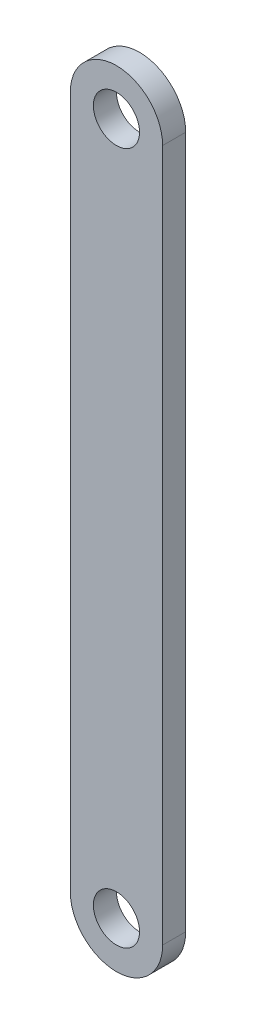
ISO-10303-21;
HEADER;
FILE_DESCRIPTION(('STEP AP214'),'2;1');
FILE_NAME('part.step','',(''),(''),'','','');
FILE_SCHEMA(('AUTOMOTIVE_DESIGN { 1 0 10303 214 1 1 1 1 }'));
ENDSEC;
DATA;
#1=APPLICATION_CONTEXT('core data for automotive mechanical design processes');
#2=APPLICATION_PROTOCOL_DEFINITION('international standard','automotive_design',2000,#1);
#3=PRODUCT_CONTEXT('',#1,'mechanical');
#4=PRODUCT('Part','Part','',(#3));
#5=PRODUCT_RELATED_PRODUCT_CATEGORY('part','',(#4));
#6=PRODUCT_DEFINITION_FORMATION('','',#4);
#7=PRODUCT_DEFINITION_CONTEXT('part definition',#1,'design');
#8=PRODUCT_DEFINITION('design','',#6,#7);
#9=PRODUCT_DEFINITION_SHAPE('','',#8);
#10=(LENGTH_UNIT() NAMED_UNIT(*) SI_UNIT(.MILLI.,.METRE.));
#11=(NAMED_UNIT(*) PLANE_ANGLE_UNIT() SI_UNIT($,.RADIAN.));
#12=(NAMED_UNIT(*) SI_UNIT($,.STERADIAN.) SOLID_ANGLE_UNIT());
#13=UNCERTAINTY_MEASURE_WITH_UNIT(LENGTH_MEASURE(1.E-05),#10,'distance_accuracy_value','');
#14=(GEOMETRIC_REPRESENTATION_CONTEXT(3) GLOBAL_UNCERTAINTY_ASSIGNED_CONTEXT((#13)) GLOBAL_UNIT_ASSIGNED_CONTEXT((#10,
#11,#12)) REPRESENTATION_CONTEXT('',''));
#15=CARTESIAN_POINT('',(0.,0.,0.));
#16=DIRECTION('',(0.,0.,1.));
#17=DIRECTION('',(1.,0.,0.));
#18=AXIS2_PLACEMENT_3D('',#15,#16,#17);
#19=CARTESIAN_POINT('',(0.,-381.,12.7));
#20=DIRECTION('',(0.,0.,1.));
#21=DIRECTION('',(1.,0.,0.));
#22=AXIS2_PLACEMENT_3D('',#19,#20,#21);
#23=PLANE('',#22);
#24=CARTESIAN_POINT('',(0.,0.,12.7));
#25=DIRECTION('',(0.,0.,1.));
#26=DIRECTION('',(1.,0.,0.));
#27=AXIS2_PLACEMENT_3D('',#24,#25,#26);
#28=CIRCLE('',#27,12.7);
#29=CARTESIAN_POINT('',(12.7,0.,12.7));
#30=VERTEX_POINT('',#29);
#31=EDGE_CURVE('E104',#30,#30,#28,.T.);
#32=ORIENTED_EDGE('',*,*,#31,.F.);
#33=EDGE_LOOP('',(#32));
#34=FACE_BOUND('',#33,.T.);
#35=CARTESIAN_POINT('',(0.,-381.,12.7));
#36=DIRECTION('',(0.,0.,1.));
#37=DIRECTION('',(1.,0.,0.));
#38=AXIS2_PLACEMENT_3D('',#35,#36,#37);
#39=CIRCLE('',#38,25.4);
#40=CARTESIAN_POINT('',(-25.3999999999999,-381.,12.7));
#41=VERTEX_POINT('',#40);
#42=CARTESIAN_POINT('',(25.4000000000001,-381.,12.7));
#43=VERTEX_POINT('',#42);
#44=EDGE_CURVE('E89',#41,#43,#39,.T.);
#45=ORIENTED_EDGE('',*,*,#44,.T.);
#46=DIRECTION('',(0.,1.,0.));
#47=VECTOR('',#46,1.);
#48=CARTESIAN_POINT('',(25.3999999999999,0.,12.7));
#49=LINE('',#48,#47);
#50=CARTESIAN_POINT('',(25.3999999999999,0.,12.7));
#51=VERTEX_POINT('',#50);
#52=EDGE_CURVE('E84',#43,#51,#49,.T.);
#53=ORIENTED_EDGE('',*,*,#52,.T.);
#54=CARTESIAN_POINT('',(0.,0.,12.7));
#55=DIRECTION('',(0.,0.,1.));
#56=DIRECTION('',(1.,0.,0.));
#57=AXIS2_PLACEMENT_3D('',#54,#55,#56);
#58=CIRCLE('',#57,25.3999999999999);
#59=CARTESIAN_POINT('',(-25.3999999999999,0.,12.7));
#60=VERTEX_POINT('',#59);
#61=EDGE_CURVE('E87',#51,#60,#58,.T.);
#62=ORIENTED_EDGE('',*,*,#61,.T.);
#63=DIRECTION('',(0.,-1.,0.));
#64=VECTOR('',#63,1.);
#65=CARTESIAN_POINT('',(-25.3999999999999,-381.,12.7));
#66=LINE('',#65,#64);
#67=EDGE_CURVE('E54',#60,#41,#66,.T.);
#68=ORIENTED_EDGE('',*,*,#67,.T.);
#69=EDGE_LOOP('',(#45,#53,#62,#68));
#70=FACE_BOUND('',#69,.T.);
#71=CARTESIAN_POINT('',(0.,-381.,12.7));
#72=DIRECTION('',(0.,0.,1.));
#73=DIRECTION('',(1.,0.,0.));
#74=AXIS2_PLACEMENT_3D('',#71,#72,#73);
#75=CIRCLE('',#74,12.7);
#76=CARTESIAN_POINT('',(12.7,-381.,12.7));
#77=VERTEX_POINT('',#76);
#78=EDGE_CURVE('E119',#77,#77,#75,.T.);
#79=ORIENTED_EDGE('',*,*,#78,.F.);
#80=EDGE_LOOP('',(#79));
#81=FACE_BOUND('',#80,.T.);
#82=ADVANCED_FACE('F37',(#34,#70,#81),#23,.T.);
#83=CARTESIAN_POINT('',(0.,-381.,0.));
#84=DIRECTION('',(0.,0.,1.));
#85=DIRECTION('',(1.,0.,0.));
#86=AXIS2_PLACEMENT_3D('',#83,#84,#85);
#87=PLANE('',#86);
#88=CARTESIAN_POINT('',(0.,-381.,0.));
#89=DIRECTION('',(0.,0.,1.));
#90=DIRECTION('',(1.,0.,0.));
#91=AXIS2_PLACEMENT_3D('',#88,#89,#90);
#92=CIRCLE('',#91,25.4);
#93=CARTESIAN_POINT('',(-25.3999999999999,-381.,0.));
#94=VERTEX_POINT('',#93);
#95=CARTESIAN_POINT('',(25.4000000000001,-381.,0.));
#96=VERTEX_POINT('',#95);
#97=EDGE_CURVE('E101',#94,#96,#92,.T.);
#98=ORIENTED_EDGE('',*,*,#97,.F.);
#99=DIRECTION('',(0.,-1.,0.));
#100=VECTOR('',#99,1.);
#101=CARTESIAN_POINT('',(-25.3999999999999,-381.,0.));
#102=LINE('',#101,#100);
#103=CARTESIAN_POINT('',(-25.3999999999999,0.,0.));
#104=VERTEX_POINT('',#103);
#105=EDGE_CURVE('E77',#104,#94,#102,.T.);
#106=ORIENTED_EDGE('',*,*,#105,.F.);
#107=CARTESIAN_POINT('',(0.,0.,0.));
#108=DIRECTION('',(0.,0.,1.));
#109=DIRECTION('',(1.,0.,0.));
#110=AXIS2_PLACEMENT_3D('',#107,#108,#109);
#111=CIRCLE('',#110,25.3999999999999);
#112=CARTESIAN_POINT('',(25.3999999999999,0.,0.));
#113=VERTEX_POINT('',#112);
#114=EDGE_CURVE('E71',#113,#104,#111,.T.);
#115=ORIENTED_EDGE('',*,*,#114,.F.);
#116=DIRECTION('',(0.,1.,0.));
#117=VECTOR('',#116,1.);
#118=CARTESIAN_POINT('',(25.3999999999999,0.,0.));
#119=LINE('',#118,#117);
#120=EDGE_CURVE('E93',#96,#113,#119,.T.);
#121=ORIENTED_EDGE('',*,*,#120,.F.);
#122=EDGE_LOOP('',(#98,#106,#115,#121));
#123=FACE_BOUND('',#122,.T.);
#124=CARTESIAN_POINT('',(0.,0.,0.));
#125=DIRECTION('',(0.,0.,1.));
#126=DIRECTION('',(1.,0.,0.));
#127=AXIS2_PLACEMENT_3D('',#124,#125,#126);
#128=CIRCLE('',#127,12.7);
#129=CARTESIAN_POINT('',(12.7,0.,0.));
#130=VERTEX_POINT('',#129);
#131=EDGE_CURVE('E116',#130,#130,#128,.T.);
#132=ORIENTED_EDGE('',*,*,#131,.T.);
#133=EDGE_LOOP('',(#132));
#134=FACE_BOUND('',#133,.T.);
#135=CARTESIAN_POINT('',(0.,-381.,0.));
#136=DIRECTION('',(0.,0.,1.));
#137=DIRECTION('',(1.,0.,0.));
#138=AXIS2_PLACEMENT_3D('',#135,#136,#137);
#139=CIRCLE('',#138,12.7);
#140=CARTESIAN_POINT('',(12.7,-381.,0.));
#141=VERTEX_POINT('',#140);
#142=EDGE_CURVE('E122',#141,#141,#139,.T.);
#143=ORIENTED_EDGE('',*,*,#142,.T.);
#144=EDGE_LOOP('',(#143));
#145=FACE_BOUND('',#144,.T.);
#146=ADVANCED_FACE('F112',(#123,#134,#145),#87,.F.);
#147=CARTESIAN_POINT('',(0.,-381.,12.7));
#148=DIRECTION('',(0.,0.,-1.));
#149=DIRECTION('',(-1.,0.,0.));
#150=AXIS2_PLACEMENT_3D('',#147,#148,#149);
#151=CYLINDRICAL_SURFACE('',#150,25.4);
#152=ORIENTED_EDGE('',*,*,#97,.T.);
#153=DIRECTION('',(0.,0.,-1.));
#154=VECTOR('',#153,1.);
#155=CARTESIAN_POINT('',(25.4000000000001,-381.,12.7));
#156=LINE('',#155,#154);
#157=EDGE_CURVE('E11',#43,#96,#156,.T.);
#158=ORIENTED_EDGE('',*,*,#157,.F.);
#159=ORIENTED_EDGE('',*,*,#44,.F.);
#160=DIRECTION('',(0.,0.,-1.));
#161=VECTOR('',#160,1.);
#162=CARTESIAN_POINT('',(-25.3999999999999,-381.,12.7));
#163=LINE('',#162,#161);
#164=EDGE_CURVE('E97',#41,#94,#163,.T.);
#165=ORIENTED_EDGE('',*,*,#164,.T.);
#166=EDGE_LOOP('',(#152,#158,#159,#165));
#167=FACE_BOUND('',#166,.T.);
#168=ADVANCED_FACE('F39',(#167),#151,.T.);
#169=CARTESIAN_POINT('',(25.3999999999999,0.,12.7));
#170=DIRECTION('',(-1.,0.,0.));
#171=DIRECTION('',(0.,-1.,0.));
#172=AXIS2_PLACEMENT_3D('',#169,#170,#171);
#173=PLANE('',#172);
#174=ORIENTED_EDGE('',*,*,#120,.T.);
#175=DIRECTION('',(0.,0.,-1.));
#176=VECTOR('',#175,1.);
#177=CARTESIAN_POINT('',(25.3999999999999,0.,12.7));
#178=LINE('',#177,#176);
#179=EDGE_CURVE('E46',#51,#113,#178,.T.);
#180=ORIENTED_EDGE('',*,*,#179,.F.);
#181=ORIENTED_EDGE('',*,*,#52,.F.);
#182=ORIENTED_EDGE('',*,*,#157,.T.);
#183=EDGE_LOOP('',(#174,#180,#181,#182));
#184=FACE_BOUND('',#183,.T.);
#185=ADVANCED_FACE('F92',(#184),#173,.F.);
#186=CARTESIAN_POINT('',(0.,0.,12.7));
#187=DIRECTION('',(0.,0.,-1.));
#188=DIRECTION('',(-1.,0.,0.));
#189=AXIS2_PLACEMENT_3D('',#186,#187,#188);
#190=CYLINDRICAL_SURFACE('',#189,25.3999999999999);
#191=ORIENTED_EDGE('',*,*,#114,.T.);
#192=DIRECTION('',(0.,0.,-1.));
#193=VECTOR('',#192,1.);
#194=CARTESIAN_POINT('',(-25.3999999999999,0.,12.7));
#195=LINE('',#194,#193);
#196=EDGE_CURVE('E94',#60,#104,#195,.T.);
#197=ORIENTED_EDGE('',*,*,#196,.F.);
#198=ORIENTED_EDGE('',*,*,#61,.F.);
#199=ORIENTED_EDGE('',*,*,#179,.T.);
#200=EDGE_LOOP('',(#191,#197,#198,#199));
#201=FACE_BOUND('',#200,.T.);
#202=ADVANCED_FACE('F95',(#201),#190,.T.);
#203=CARTESIAN_POINT('',(-25.3999999999999,-381.,12.7));
#204=DIRECTION('',(1.,0.,0.));
#205=DIRECTION('',(0.,1.,0.));
#206=AXIS2_PLACEMENT_3D('',#203,#204,#205);
#207=PLANE('',#206);
#208=ORIENTED_EDGE('',*,*,#105,.T.);
#209=ORIENTED_EDGE('',*,*,#164,.F.);
#210=ORIENTED_EDGE('',*,*,#67,.F.);
#211=ORIENTED_EDGE('',*,*,#196,.T.);
#212=EDGE_LOOP('',(#208,#209,#210,#211));
#213=FACE_BOUND('',#212,.T.);
#214=ADVANCED_FACE('F109',(#213),#207,.F.);
#215=CARTESIAN_POINT('',(0.,0.,12.7));
#216=DIRECTION('',(0.,0.,-1.));
#217=DIRECTION('',(-1.,0.,0.));
#218=AXIS2_PLACEMENT_3D('',#215,#216,#217);
#219=CYLINDRICAL_SURFACE('',#218,12.7);
#220=ORIENTED_EDGE('',*,*,#31,.T.);
#221=EDGE_LOOP('',(#220));
#222=FACE_BOUND('',#221,.T.);
#223=ORIENTED_EDGE('',*,*,#131,.F.);
#224=EDGE_LOOP('',(#223));
#225=FACE_BOUND('',#224,.T.);
#226=ADVANCED_FACE('F139',(#222,#225),#219,.F.);
#227=CARTESIAN_POINT('',(0.,-381.,12.7));
#228=DIRECTION('',(0.,0.,-1.));
#229=DIRECTION('',(-1.,0.,0.));
#230=AXIS2_PLACEMENT_3D('',#227,#228,#229);
#231=CYLINDRICAL_SURFACE('',#230,12.7);
#232=ORIENTED_EDGE('',*,*,#78,.T.);
#233=EDGE_LOOP('',(#232));
#234=FACE_BOUND('',#233,.T.);
#235=ORIENTED_EDGE('',*,*,#142,.F.);
#236=EDGE_LOOP('',(#235));
#237=FACE_BOUND('',#236,.T.);
#238=ADVANCED_FACE('F128',(#234,#237),#231,.F.);
#239=CLOSED_SHELL('',(#82,#146,#168,#185,#202,#214,#226,#238));
#240=MANIFOLD_SOLID_BREP('B2',#239);
#241=ADVANCED_BREP_SHAPE_REPRESENTATION('',(#18,#240),#14);
#242=SHAPE_DEFINITION_REPRESENTATION(#9,#241);
ENDSEC;
END-ISO-10303-21;
